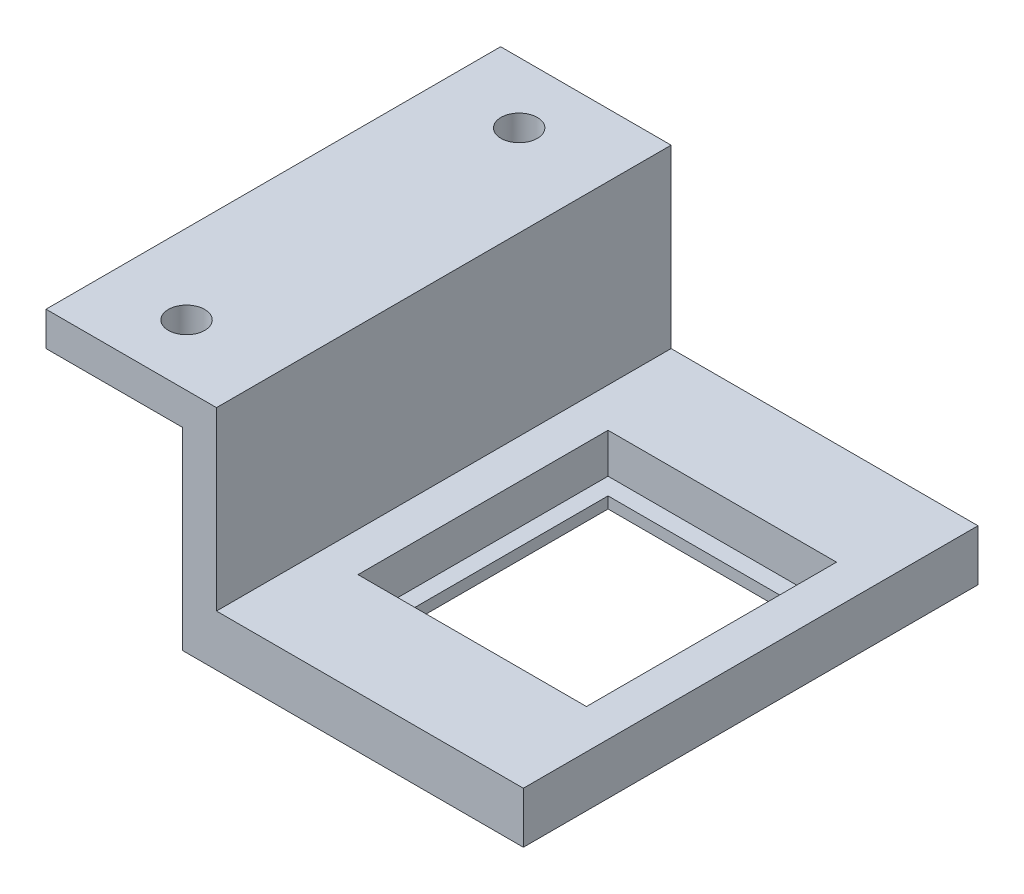
ISO-10303-21;
HEADER;
FILE_DESCRIPTION(('STEP AP214'),'2;1');
FILE_NAME('part.step','',(''),(''),'','','');
FILE_SCHEMA(('AUTOMOTIVE_DESIGN { 1 0 10303 214 1 1 1 1 }'));
ENDSEC;
DATA;
#1=APPLICATION_CONTEXT('core data for automotive mechanical design processes');
#2=APPLICATION_PROTOCOL_DEFINITION('international standard','automotive_design',2000,#1);
#3=PRODUCT_CONTEXT('',#1,'mechanical');
#4=PRODUCT('Part','Part','',(#3));
#5=PRODUCT_RELATED_PRODUCT_CATEGORY('part','',(#4));
#6=PRODUCT_DEFINITION_FORMATION('','',#4);
#7=PRODUCT_DEFINITION_CONTEXT('part definition',#1,'design');
#8=PRODUCT_DEFINITION('design','',#6,#7);
#9=PRODUCT_DEFINITION_SHAPE('','',#8);
#10=(LENGTH_UNIT() NAMED_UNIT(*) SI_UNIT(.MILLI.,.METRE.));
#11=(NAMED_UNIT(*) PLANE_ANGLE_UNIT() SI_UNIT($,.RADIAN.));
#12=(NAMED_UNIT(*) SI_UNIT($,.STERADIAN.) SOLID_ANGLE_UNIT());
#13=UNCERTAINTY_MEASURE_WITH_UNIT(LENGTH_MEASURE(1.E-05),#10,'distance_accuracy_value','');
#14=(GEOMETRIC_REPRESENTATION_CONTEXT(3) GLOBAL_UNCERTAINTY_ASSIGNED_CONTEXT((#13)) GLOBAL_UNIT_ASSIGNED_CONTEXT((#10,
#11,#12)) REPRESENTATION_CONTEXT('',''));
#15=CARTESIAN_POINT('',(0.,0.,0.));
#16=DIRECTION('',(0.,0.,1.));
#17=DIRECTION('',(1.,0.,0.));
#18=AXIS2_PLACEMENT_3D('',#15,#16,#17);
#19=CARTESIAN_POINT('',(30.,0.,-40.));
#20=DIRECTION('',(0.,-1.,0.));
#21=DIRECTION('',(0.,0.,-1.));
#22=AXIS2_PLACEMENT_3D('',#19,#20,#21);
#23=PLANE('',#22);
#24=DIRECTION('',(0.,0.,1.));
#25=VECTOR('',#24,1.);
#26=CARTESIAN_POINT('',(7.95,0.,-29.5));
#27=LINE('',#26,#25);
#28=CARTESIAN_POINT('',(7.95,0.,-29.5));
#29=VERTEX_POINT('',#28);
#30=CARTESIAN_POINT('',(7.95,0.,-10.5));
#31=VERTEX_POINT('',#30);
#32=EDGE_CURVE('E160',#29,#31,#27,.T.);
#33=ORIENTED_EDGE('',*,*,#32,.T.);
#34=DIRECTION('',(1.,0.,0.));
#35=VECTOR('',#34,1.);
#36=CARTESIAN_POINT('',(7.95,0.,-10.5));
#37=LINE('',#36,#35);
#38=CARTESIAN_POINT('',(25.05,0.,-10.5));
#39=VERTEX_POINT('',#38);
#40=EDGE_CURVE('E172',#31,#39,#37,.T.);
#41=ORIENTED_EDGE('',*,*,#40,.T.);
#42=DIRECTION('',(0.,0.,-1.));
#43=VECTOR('',#42,1.);
#44=CARTESIAN_POINT('',(25.05,0.,-29.5));
#45=LINE('',#44,#43);
#46=CARTESIAN_POINT('',(25.05,0.,-29.5));
#47=VERTEX_POINT('',#46);
#48=EDGE_CURVE('E65',#39,#47,#45,.T.);
#49=ORIENTED_EDGE('',*,*,#48,.T.);
#50=DIRECTION('',(-1.,0.,0.));
#51=VECTOR('',#50,1.);
#52=CARTESIAN_POINT('',(7.95,0.,-29.5));
#53=LINE('',#52,#51);
#54=EDGE_CURVE('E169',#47,#29,#53,.T.);
#55=ORIENTED_EDGE('',*,*,#54,.T.);
#56=EDGE_LOOP('',(#33,#41,#49,#55));
#57=FACE_BOUND('',#56,.T.);
#58=DIRECTION('',(1.,0.,0.));
#59=VECTOR('',#58,1.);
#60=CARTESIAN_POINT('',(30.,0.,0.));
#61=LINE('',#60,#59);
#62=CARTESIAN_POINT('',(0.,0.,0.));
#63=VERTEX_POINT('',#62);
#64=CARTESIAN_POINT('',(30.,0.,0.));
#65=VERTEX_POINT('',#64);
#66=EDGE_CURVE('E243',#63,#65,#61,.T.);
#67=ORIENTED_EDGE('',*,*,#66,.F.);
#68=DIRECTION('',(0.,0.,1.));
#69=VECTOR('',#68,1.);
#70=CARTESIAN_POINT('',(0.,0.,-40.));
#71=LINE('',#70,#69);
#72=CARTESIAN_POINT('',(0.,0.,-40.));
#73=VERTEX_POINT('',#72);
#74=EDGE_CURVE('E11',#73,#63,#71,.T.);
#75=ORIENTED_EDGE('',*,*,#74,.F.);
#76=DIRECTION('',(1.,0.,0.));
#77=VECTOR('',#76,1.);
#78=CARTESIAN_POINT('',(30.,0.,-40.));
#79=LINE('',#78,#77);
#80=CARTESIAN_POINT('',(30.,0.,-40.));
#81=VERTEX_POINT('',#80);
#82=EDGE_CURVE('E253',#73,#81,#79,.T.);
#83=ORIENTED_EDGE('',*,*,#82,.T.);
#84=DIRECTION('',(0.,0.,1.));
#85=VECTOR('',#84,1.);
#86=CARTESIAN_POINT('',(30.,0.,-40.));
#87=LINE('',#86,#85);
#88=EDGE_CURVE('E46',#81,#65,#87,.T.);
#89=ORIENTED_EDGE('',*,*,#88,.T.);
#90=EDGE_LOOP('',(#67,#75,#83,#89));
#91=FACE_BOUND('',#90,.T.);
#92=ADVANCED_FACE('F43',(#57,#91),#23,.T.);
#93=CARTESIAN_POINT('',(0.,0.,-40.));
#94=DIRECTION('',(-1.,0.,0.));
#95=DIRECTION('',(0.,0.,1.));
#96=AXIS2_PLACEMENT_3D('',#93,#94,#95);
#97=PLANE('',#96);
#98=DIRECTION('',(0.,-1.,0.));
#99=VECTOR('',#98,1.);
#100=CARTESIAN_POINT('',(0.,0.,0.));
#101=LINE('',#100,#99);
#102=CARTESIAN_POINT('',(0.,17.,0.));
#103=VERTEX_POINT('',#102);
#104=EDGE_CURVE('E258',#103,#63,#101,.T.);
#105=ORIENTED_EDGE('',*,*,#104,.F.);
#106=DIRECTION('',(0.,0.,1.));
#107=VECTOR('',#106,1.);
#108=CARTESIAN_POINT('',(0.,17.,-40.));
#109=LINE('',#108,#107);
#110=CARTESIAN_POINT('',(0.,17.,-40.));
#111=VERTEX_POINT('',#110);
#112=EDGE_CURVE('E52',#111,#103,#109,.T.);
#113=ORIENTED_EDGE('',*,*,#112,.F.);
#114=DIRECTION('',(0.,-1.,0.));
#115=VECTOR('',#114,1.);
#116=CARTESIAN_POINT('',(0.,0.,-40.));
#117=LINE('',#116,#115);
#118=EDGE_CURVE('E282',#111,#73,#117,.T.);
#119=ORIENTED_EDGE('',*,*,#118,.T.);
#120=ORIENTED_EDGE('',*,*,#74,.T.);
#121=EDGE_LOOP('',(#105,#113,#119,#120));
#122=FACE_BOUND('',#121,.T.);
#123=ADVANCED_FACE('F344',(#122),#97,.T.);
#124=CARTESIAN_POINT('',(0.,17.,-40.));
#125=DIRECTION('',(0.,-1.,0.));
#126=DIRECTION('',(0.,0.,-1.));
#127=AXIS2_PLACEMENT_3D('',#124,#125,#126);
#128=PLANE('',#127);
#129=CARTESIAN_POINT('',(-5.,17.,-34.63));
#130=DIRECTION('',(0.,-1.,0.));
#131=DIRECTION('',(0.,0.,-1.));
#132=AXIS2_PLACEMENT_3D('',#129,#130,#131);
#133=CIRCLE('',#132,1.6);
#134=CARTESIAN_POINT('',(-5.,17.,-36.23));
#135=VERTEX_POINT('',#134);
#136=EDGE_CURVE('E186',#135,#135,#133,.T.);
#137=ORIENTED_EDGE('',*,*,#136,.F.);
#138=EDGE_LOOP('',(#137));
#139=FACE_BOUND('',#138,.T.);
#140=CARTESIAN_POINT('',(-5.,17.,-5.366));
#141=DIRECTION('',(0.,-1.,0.));
#142=DIRECTION('',(0.,0.,-1.));
#143=AXIS2_PLACEMENT_3D('',#140,#141,#142);
#144=CIRCLE('',#143,1.6);
#145=CARTESIAN_POINT('',(-5.,17.,-6.966));
#146=VERTEX_POINT('',#145);
#147=EDGE_CURVE('E607',#146,#146,#144,.T.);
#148=ORIENTED_EDGE('',*,*,#147,.F.);
#149=EDGE_LOOP('',(#148));
#150=FACE_BOUND('',#149,.T.);
#151=DIRECTION('',(1.,0.,0.));
#152=VECTOR('',#151,1.);
#153=CARTESIAN_POINT('',(0.,17.,0.));
#154=LINE('',#153,#152);
#155=CARTESIAN_POINT('',(-12.,17.,0.));
#156=VERTEX_POINT('',#155);
#157=EDGE_CURVE('E309',#156,#103,#154,.T.);
#158=ORIENTED_EDGE('',*,*,#157,.F.);
#159=DIRECTION('',(0.,0.,1.));
#160=VECTOR('',#159,1.);
#161=CARTESIAN_POINT('',(-12.,17.,-40.));
#162=LINE('',#161,#160);
#163=CARTESIAN_POINT('',(-12.,17.,-40.));
#164=VERTEX_POINT('',#163);
#165=EDGE_CURVE('E318',#164,#156,#162,.T.);
#166=ORIENTED_EDGE('',*,*,#165,.F.);
#167=DIRECTION('',(1.,0.,0.));
#168=VECTOR('',#167,1.);
#169=CARTESIAN_POINT('',(0.,17.,-40.));
#170=LINE('',#169,#168);
#171=EDGE_CURVE('E278',#164,#111,#170,.T.);
#172=ORIENTED_EDGE('',*,*,#171,.T.);
#173=ORIENTED_EDGE('',*,*,#112,.T.);
#174=EDGE_LOOP('',(#158,#166,#172,#173));
#175=FACE_BOUND('',#174,.T.);
#176=ADVANCED_FACE('F365',(#139,#150,#175),#128,.T.);
#177=CARTESIAN_POINT('',(-12.,17.,-40.));
#178=DIRECTION('',(-1.,0.,0.));
#179=DIRECTION('',(0.,0.,1.));
#180=AXIS2_PLACEMENT_3D('',#177,#178,#179);
#181=PLANE('',#180);
#182=DIRECTION('',(0.,-1.,0.));
#183=VECTOR('',#182,1.);
#184=CARTESIAN_POINT('',(-12.,17.,0.));
#185=LINE('',#184,#183);
#186=CARTESIAN_POINT('',(-12.,20.,0.));
#187=VERTEX_POINT('',#186);
#188=EDGE_CURVE('E305',#187,#156,#185,.T.);
#189=ORIENTED_EDGE('',*,*,#188,.F.);
#190=DIRECTION('',(0.,0.,1.));
#191=VECTOR('',#190,1.);
#192=CARTESIAN_POINT('',(-12.,20.,-40.));
#193=LINE('',#192,#191);
#194=CARTESIAN_POINT('',(-12.,20.,-40.));
#195=VERTEX_POINT('',#194);
#196=EDGE_CURVE('E321',#195,#187,#193,.T.);
#197=ORIENTED_EDGE('',*,*,#196,.F.);
#198=DIRECTION('',(0.,-1.,0.));
#199=VECTOR('',#198,1.);
#200=CARTESIAN_POINT('',(-12.,17.,-40.));
#201=LINE('',#200,#199);
#202=EDGE_CURVE('E274',#195,#164,#201,.T.);
#203=ORIENTED_EDGE('',*,*,#202,.T.);
#204=ORIENTED_EDGE('',*,*,#165,.T.);
#205=EDGE_LOOP('',(#189,#197,#203,#204));
#206=FACE_BOUND('',#205,.T.);
#207=ADVANCED_FACE('F363',(#206),#181,.T.);
#208=CARTESIAN_POINT('',(-12.,20.,-40.));
#209=DIRECTION('',(0.,1.,0.));
#210=DIRECTION('',(0.,0.,1.));
#211=AXIS2_PLACEMENT_3D('',#208,#209,#210);
#212=PLANE('',#211);
#213=CARTESIAN_POINT('',(-5.,20.,-34.63));
#214=DIRECTION('',(0.,1.,0.));
#215=DIRECTION('',(0.,0.,1.));
#216=AXIS2_PLACEMENT_3D('',#213,#214,#215);
#217=CIRCLE('',#216,1.6);
#218=CARTESIAN_POINT('',(-5.,20.,-33.03));
#219=VERTEX_POINT('',#218);
#220=EDGE_CURVE('E599',#219,#219,#217,.T.);
#221=ORIENTED_EDGE('',*,*,#220,.F.);
#222=EDGE_LOOP('',(#221));
#223=FACE_BOUND('',#222,.T.);
#224=CARTESIAN_POINT('',(-5.,20.,-5.366));
#225=DIRECTION('',(0.,1.,0.));
#226=DIRECTION('',(0.,0.,1.));
#227=AXIS2_PLACEMENT_3D('',#224,#225,#226);
#228=CIRCLE('',#227,1.6);
#229=CARTESIAN_POINT('',(-5.,20.,-3.766));
#230=VERTEX_POINT('',#229);
#231=EDGE_CURVE('E602',#230,#230,#228,.T.);
#232=ORIENTED_EDGE('',*,*,#231,.F.);
#233=EDGE_LOOP('',(#232));
#234=FACE_BOUND('',#233,.T.);
#235=DIRECTION('',(-1.,0.,0.));
#236=VECTOR('',#235,1.);
#237=CARTESIAN_POINT('',(-12.,20.,0.));
#238=LINE('',#237,#236);
#239=CARTESIAN_POINT('',(3.,20.,0.));
#240=VERTEX_POINT('',#239);
#241=EDGE_CURVE('E301',#240,#187,#238,.T.);
#242=ORIENTED_EDGE('',*,*,#241,.F.);
#243=DIRECTION('',(0.,0.,1.));
#244=VECTOR('',#243,1.);
#245=CARTESIAN_POINT('',(3.,20.,-40.));
#246=LINE('',#245,#244);
#247=CARTESIAN_POINT('',(3.,20.,-40.));
#248=VERTEX_POINT('',#247);
#249=EDGE_CURVE('E324',#248,#240,#246,.T.);
#250=ORIENTED_EDGE('',*,*,#249,.F.);
#251=DIRECTION('',(-1.,0.,0.));
#252=VECTOR('',#251,1.);
#253=CARTESIAN_POINT('',(-12.,20.,-40.));
#254=LINE('',#253,#252);
#255=EDGE_CURVE('E270',#248,#195,#254,.T.);
#256=ORIENTED_EDGE('',*,*,#255,.T.);
#257=ORIENTED_EDGE('',*,*,#196,.T.);
#258=EDGE_LOOP('',(#242,#250,#256,#257));
#259=FACE_BOUND('',#258,.T.);
#260=ADVANCED_FACE('F359',(#223,#234,#259),#212,.T.);
#261=CARTESIAN_POINT('',(3.,20.,-40.));
#262=DIRECTION('',(1.,0.,0.));
#263=DIRECTION('',(0.,1.,0.));
#264=AXIS2_PLACEMENT_3D('',#261,#262,#263);
#265=PLANE('',#264);
#266=DIRECTION('',(0.,1.,0.));
#267=VECTOR('',#266,1.);
#268=CARTESIAN_POINT('',(3.,20.,0.));
#269=LINE('',#268,#267);
#270=CARTESIAN_POINT('',(3.,4.5,0.));
#271=VERTEX_POINT('',#270);
#272=EDGE_CURVE('E297',#271,#240,#269,.T.);
#273=ORIENTED_EDGE('',*,*,#272,.F.);
#274=DIRECTION('',(0.,0.,1.));
#275=VECTOR('',#274,1.);
#276=CARTESIAN_POINT('',(3.,4.5,-40.));
#277=LINE('',#276,#275);
#278=CARTESIAN_POINT('',(3.,4.5,-40.));
#279=VERTEX_POINT('',#278);
#280=EDGE_CURVE('E327',#279,#271,#277,.T.);
#281=ORIENTED_EDGE('',*,*,#280,.F.);
#282=DIRECTION('',(0.,1.,0.));
#283=VECTOR('',#282,1.);
#284=CARTESIAN_POINT('',(3.,20.,-40.));
#285=LINE('',#284,#283);
#286=EDGE_CURVE('E266',#279,#248,#285,.T.);
#287=ORIENTED_EDGE('',*,*,#286,.T.);
#288=ORIENTED_EDGE('',*,*,#249,.T.);
#289=EDGE_LOOP('',(#273,#281,#287,#288));
#290=FACE_BOUND('',#289,.T.);
#291=ADVANCED_FACE('F357',(#290),#265,.T.);
#292=CARTESIAN_POINT('',(3.,4.5,-40.));
#293=DIRECTION('',(0.,1.,0.));
#294=DIRECTION('',(0.,0.,1.));
#295=AXIS2_PLACEMENT_3D('',#292,#293,#294);
#296=PLANE('',#295);
#297=DIRECTION('',(0.,0.,1.));
#298=VECTOR('',#297,1.);
#299=CARTESIAN_POINT('',(6.45,4.5,-31.));
#300=LINE('',#299,#298);
#301=CARTESIAN_POINT('',(6.45,4.5,-31.));
#302=VERTEX_POINT('',#301);
#303=CARTESIAN_POINT('',(6.45,4.5,-9.));
#304=VERTEX_POINT('',#303);
#305=EDGE_CURVE('E203',#302,#304,#300,.T.);
#306=ORIENTED_EDGE('',*,*,#305,.F.);
#307=DIRECTION('',(-1.,0.,0.));
#308=VECTOR('',#307,1.);
#309=CARTESIAN_POINT('',(6.45,4.5,-31.));
#310=LINE('',#309,#308);
#311=CARTESIAN_POINT('',(26.55,4.5,-31.));
#312=VERTEX_POINT('',#311);
#313=EDGE_CURVE('E214',#312,#302,#310,.T.);
#314=ORIENTED_EDGE('',*,*,#313,.F.);
#315=DIRECTION('',(0.,0.,-1.));
#316=VECTOR('',#315,1.);
#317=CARTESIAN_POINT('',(26.55,4.5,-31.));
#318=LINE('',#317,#316);
#319=CARTESIAN_POINT('',(26.55,4.5,-9.));
#320=VERTEX_POINT('',#319);
#321=EDGE_CURVE('E233',#320,#312,#318,.T.);
#322=ORIENTED_EDGE('',*,*,#321,.F.);
#323=DIRECTION('',(1.,0.,0.));
#324=VECTOR('',#323,1.);
#325=CARTESIAN_POINT('',(6.45,4.5,-8.99999999999999));
#326=LINE('',#325,#324);
#327=EDGE_CURVE('E229',#304,#320,#326,.T.);
#328=ORIENTED_EDGE('',*,*,#327,.F.);
#329=EDGE_LOOP('',(#306,#314,#322,#328));
#330=FACE_BOUND('',#329,.T.);
#331=DIRECTION('',(-1.,0.,0.));
#332=VECTOR('',#331,1.);
#333=CARTESIAN_POINT('',(3.,4.5,0.));
#334=LINE('',#333,#332);
#335=CARTESIAN_POINT('',(30.,4.5,0.));
#336=VERTEX_POINT('',#335);
#337=EDGE_CURVE('E293',#336,#271,#334,.T.);
#338=ORIENTED_EDGE('',*,*,#337,.F.);
#339=DIRECTION('',(0.,0.,1.));
#340=VECTOR('',#339,1.);
#341=CARTESIAN_POINT('',(30.,4.5,-40.));
#342=LINE('',#341,#340);
#343=CARTESIAN_POINT('',(30.,4.5,-40.));
#344=VERTEX_POINT('',#343);
#345=EDGE_CURVE('E329',#344,#336,#342,.T.);
#346=ORIENTED_EDGE('',*,*,#345,.F.);
#347=DIRECTION('',(-1.,0.,0.));
#348=VECTOR('',#347,1.);
#349=CARTESIAN_POINT('',(3.,4.5,-40.));
#350=LINE('',#349,#348);
#351=EDGE_CURVE('E262',#344,#279,#350,.T.);
#352=ORIENTED_EDGE('',*,*,#351,.T.);
#353=ORIENTED_EDGE('',*,*,#280,.T.);
#354=EDGE_LOOP('',(#338,#346,#352,#353));
#355=FACE_BOUND('',#354,.T.);
#356=ADVANCED_FACE('F353',(#330,#355),#296,.T.);
#357=CARTESIAN_POINT('',(30.,4.5,-40.));
#358=DIRECTION('',(1.,0.,0.));
#359=DIRECTION('',(0.,0.,-1.));
#360=AXIS2_PLACEMENT_3D('',#357,#358,#359);
#361=PLANE('',#360);
#362=DIRECTION('',(0.,1.,0.));
#363=VECTOR('',#362,1.);
#364=CARTESIAN_POINT('',(30.,4.5,0.));
#365=LINE('',#364,#363);
#366=EDGE_CURVE('E289',#65,#336,#365,.T.);
#367=ORIENTED_EDGE('',*,*,#366,.F.);
#368=ORIENTED_EDGE('',*,*,#88,.F.);
#369=DIRECTION('',(0.,1.,0.));
#370=VECTOR('',#369,1.);
#371=CARTESIAN_POINT('',(30.,4.5,-40.));
#372=LINE('',#371,#370);
#373=EDGE_CURVE('E257',#81,#344,#372,.T.);
#374=ORIENTED_EDGE('',*,*,#373,.T.);
#375=ORIENTED_EDGE('',*,*,#345,.T.);
#376=EDGE_LOOP('',(#367,#368,#374,#375));
#377=FACE_BOUND('',#376,.T.);
#378=ADVANCED_FACE('F338',(#377),#361,.T.);
#379=CARTESIAN_POINT('',(0.,0.,-40.));
#380=DIRECTION('',(0.,0.,-1.));
#381=DIRECTION('',(-1.,0.,0.));
#382=AXIS2_PLACEMENT_3D('',#379,#380,#381);
#383=PLANE('',#382);
#384=ORIENTED_EDGE('',*,*,#82,.F.);
#385=ORIENTED_EDGE('',*,*,#118,.F.);
#386=ORIENTED_EDGE('',*,*,#171,.F.);
#387=ORIENTED_EDGE('',*,*,#202,.F.);
#388=ORIENTED_EDGE('',*,*,#255,.F.);
#389=ORIENTED_EDGE('',*,*,#286,.F.);
#390=ORIENTED_EDGE('',*,*,#351,.F.);
#391=ORIENTED_EDGE('',*,*,#373,.F.);
#392=EDGE_LOOP('',(#384,#385,#386,#387,#388,#389,#390,#391));
#393=FACE_BOUND('',#392,.T.);
#394=ADVANCED_FACE('F347',(#393),#383,.T.);
#395=CARTESIAN_POINT('',(0.,0.,0.));
#396=DIRECTION('',(0.,0.,-1.));
#397=DIRECTION('',(-1.,0.,0.));
#398=AXIS2_PLACEMENT_3D('',#395,#396,#397);
#399=PLANE('',#398);
#400=ORIENTED_EDGE('',*,*,#66,.T.);
#401=ORIENTED_EDGE('',*,*,#366,.T.);
#402=ORIENTED_EDGE('',*,*,#337,.T.);
#403=ORIENTED_EDGE('',*,*,#272,.T.);
#404=ORIENTED_EDGE('',*,*,#241,.T.);
#405=ORIENTED_EDGE('',*,*,#188,.T.);
#406=ORIENTED_EDGE('',*,*,#157,.T.);
#407=ORIENTED_EDGE('',*,*,#104,.T.);
#408=EDGE_LOOP('',(#400,#401,#402,#403,#404,#405,#406,#407));
#409=FACE_BOUND('',#408,.T.);
#410=ADVANCED_FACE('F340',(#409),#399,.F.);
#411=CARTESIAN_POINT('',(6.45,1.,-31.));
#412=DIRECTION('',(-1.,0.,0.));
#413=DIRECTION('',(0.,0.,1.));
#414=AXIS2_PLACEMENT_3D('',#411,#412,#413);
#415=PLANE('',#414);
#416=ORIENTED_EDGE('',*,*,#305,.T.);
#417=DIRECTION('',(0.,1.,0.));
#418=VECTOR('',#417,1.);
#419=CARTESIAN_POINT('',(6.45,1.,-8.99999999999999));
#420=LINE('',#419,#418);
#421=CARTESIAN_POINT('',(6.45,1.,-8.99999999999999));
#422=VERTEX_POINT('',#421);
#423=EDGE_CURVE('E226',#422,#304,#420,.T.);
#424=ORIENTED_EDGE('',*,*,#423,.F.);
#425=DIRECTION('',(0.,0.,1.));
#426=VECTOR('',#425,1.);
#427=CARTESIAN_POINT('',(6.45,1.,-31.));
#428=LINE('',#427,#426);
#429=CARTESIAN_POINT('',(6.45,1.,-31.));
#430=VERTEX_POINT('',#429);
#431=EDGE_CURVE('E209',#430,#422,#428,.T.);
#432=ORIENTED_EDGE('',*,*,#431,.F.);
#433=DIRECTION('',(0.,1.,0.));
#434=VECTOR('',#433,1.);
#435=CARTESIAN_POINT('',(6.45,1.,-31.));
#436=LINE('',#435,#434);
#437=EDGE_CURVE('E240',#430,#302,#436,.T.);
#438=ORIENTED_EDGE('',*,*,#437,.T.);
#439=EDGE_LOOP('',(#416,#424,#432,#438));
#440=FACE_BOUND('',#439,.T.);
#441=ADVANCED_FACE('F434',(#440),#415,.F.);
#442=CARTESIAN_POINT('',(6.45,1.,-31.));
#443=DIRECTION('',(0.,0.,-1.));
#444=DIRECTION('',(-1.,0.,0.));
#445=AXIS2_PLACEMENT_3D('',#442,#443,#444);
#446=PLANE('',#445);
#447=ORIENTED_EDGE('',*,*,#313,.T.);
#448=ORIENTED_EDGE('',*,*,#437,.F.);
#449=DIRECTION('',(-1.,0.,0.));
#450=VECTOR('',#449,1.);
#451=CARTESIAN_POINT('',(6.45,1.,-31.));
#452=LINE('',#451,#450);
#453=CARTESIAN_POINT('',(26.55,1.,-31.));
#454=VERTEX_POINT('',#453);
#455=EDGE_CURVE('E222',#454,#430,#452,.T.);
#456=ORIENTED_EDGE('',*,*,#455,.F.);
#457=DIRECTION('',(0.,1.,0.));
#458=VECTOR('',#457,1.);
#459=CARTESIAN_POINT('',(26.55,1.,-31.));
#460=LINE('',#459,#458);
#461=EDGE_CURVE('E244',#454,#312,#460,.T.);
#462=ORIENTED_EDGE('',*,*,#461,.T.);
#463=EDGE_LOOP('',(#447,#448,#456,#462));
#464=FACE_BOUND('',#463,.T.);
#465=ADVANCED_FACE('F452',(#464),#446,.F.);
#466=CARTESIAN_POINT('',(26.55,1.,-31.));
#467=DIRECTION('',(1.,0.,0.));
#468=DIRECTION('',(0.,0.,-1.));
#469=AXIS2_PLACEMENT_3D('',#466,#467,#468);
#470=PLANE('',#469);
#471=ORIENTED_EDGE('',*,*,#321,.T.);
#472=ORIENTED_EDGE('',*,*,#461,.F.);
#473=DIRECTION('',(0.,0.,-1.));
#474=VECTOR('',#473,1.);
#475=CARTESIAN_POINT('',(26.55,1.,-31.));
#476=LINE('',#475,#474);
#477=CARTESIAN_POINT('',(26.55,1.,-9.));
#478=VERTEX_POINT('',#477);
#479=EDGE_CURVE('E218',#478,#454,#476,.T.);
#480=ORIENTED_EDGE('',*,*,#479,.F.);
#481=DIRECTION('',(0.,1.,0.));
#482=VECTOR('',#481,1.);
#483=CARTESIAN_POINT('',(26.55,1.,-9.));
#484=LINE('',#483,#482);
#485=EDGE_CURVE('E247',#478,#320,#484,.T.);
#486=ORIENTED_EDGE('',*,*,#485,.T.);
#487=EDGE_LOOP('',(#471,#472,#480,#486));
#488=FACE_BOUND('',#487,.T.);
#489=ADVANCED_FACE('F463',(#488),#470,.F.);
#490=CARTESIAN_POINT('',(6.45,1.,-8.99999999999999));
#491=DIRECTION('',(0.,0.,1.));
#492=DIRECTION('',(1.,0.,0.));
#493=AXIS2_PLACEMENT_3D('',#490,#491,#492);
#494=PLANE('',#493);
#495=ORIENTED_EDGE('',*,*,#327,.T.);
#496=ORIENTED_EDGE('',*,*,#485,.F.);
#497=DIRECTION('',(1.,0.,0.));
#498=VECTOR('',#497,1.);
#499=CARTESIAN_POINT('',(6.45,1.,-8.99999999999999));
#500=LINE('',#499,#498);
#501=EDGE_CURVE('E213',#422,#478,#500,.T.);
#502=ORIENTED_EDGE('',*,*,#501,.F.);
#503=ORIENTED_EDGE('',*,*,#423,.T.);
#504=EDGE_LOOP('',(#495,#496,#502,#503));
#505=FACE_BOUND('',#504,.T.);
#506=ADVANCED_FACE('F473',(#505),#494,.F.);
#507=CARTESIAN_POINT('',(0.,1.,0.));
#508=DIRECTION('',(0.,1.,0.));
#509=DIRECTION('',(0.,0.,1.));
#510=AXIS2_PLACEMENT_3D('',#507,#508,#509);
#511=PLANE('',#510);
#512=DIRECTION('',(0.,0.,1.));
#513=VECTOR('',#512,1.);
#514=CARTESIAN_POINT('',(7.95,1.,-29.5));
#515=LINE('',#514,#513);
#516=CARTESIAN_POINT('',(7.95,1.,-29.5));
#517=VERTEX_POINT('',#516);
#518=CARTESIAN_POINT('',(7.95,1.,-10.5));
#519=VERTEX_POINT('',#518);
#520=EDGE_CURVE('E163',#517,#519,#515,.T.);
#521=ORIENTED_EDGE('',*,*,#520,.F.);
#522=DIRECTION('',(-1.,0.,0.));
#523=VECTOR('',#522,1.);
#524=CARTESIAN_POINT('',(7.95,1.,-29.5));
#525=LINE('',#524,#523);
#526=CARTESIAN_POINT('',(25.05,1.,-29.5));
#527=VERTEX_POINT('',#526);
#528=EDGE_CURVE('E180',#527,#517,#525,.T.);
#529=ORIENTED_EDGE('',*,*,#528,.F.);
#530=DIRECTION('',(0.,0.,-1.));
#531=VECTOR('',#530,1.);
#532=CARTESIAN_POINT('',(25.05,1.,-29.5));
#533=LINE('',#532,#531);
#534=CARTESIAN_POINT('',(25.05,1.,-10.5));
#535=VERTEX_POINT('',#534);
#536=EDGE_CURVE('E60',#535,#527,#533,.T.);
#537=ORIENTED_EDGE('',*,*,#536,.F.);
#538=DIRECTION('',(1.,0.,0.));
#539=VECTOR('',#538,1.);
#540=CARTESIAN_POINT('',(7.95,1.,-10.5));
#541=LINE('',#540,#539);
#542=EDGE_CURVE('E195',#519,#535,#541,.T.);
#543=ORIENTED_EDGE('',*,*,#542,.F.);
#544=EDGE_LOOP('',(#521,#529,#537,#543));
#545=FACE_BOUND('',#544,.T.);
#546=ORIENTED_EDGE('',*,*,#431,.T.);
#547=ORIENTED_EDGE('',*,*,#501,.T.);
#548=ORIENTED_EDGE('',*,*,#479,.T.);
#549=ORIENTED_EDGE('',*,*,#455,.T.);
#550=EDGE_LOOP('',(#546,#547,#548,#549));
#551=FACE_BOUND('',#550,.T.);
#552=ADVANCED_FACE('F483',(#545,#551),#511,.T.);
#553=CARTESIAN_POINT('',(7.95,0.,-29.5));
#554=DIRECTION('',(-1.,0.,0.));
#555=DIRECTION('',(0.,0.,1.));
#556=AXIS2_PLACEMENT_3D('',#553,#554,#555);
#557=PLANE('',#556);
#558=ORIENTED_EDGE('',*,*,#520,.T.);
#559=DIRECTION('',(0.,1.,0.));
#560=VECTOR('',#559,1.);
#561=CARTESIAN_POINT('',(7.95,0.,-10.5));
#562=LINE('',#561,#560);
#563=EDGE_CURVE('E156',#31,#519,#562,.T.);
#564=ORIENTED_EDGE('',*,*,#563,.F.);
#565=ORIENTED_EDGE('',*,*,#32,.F.);
#566=DIRECTION('',(0.,1.,0.));
#567=VECTOR('',#566,1.);
#568=CARTESIAN_POINT('',(7.95,0.,-29.5));
#569=LINE('',#568,#567);
#570=EDGE_CURVE('E200',#29,#517,#569,.T.);
#571=ORIENTED_EDGE('',*,*,#570,.T.);
#572=EDGE_LOOP('',(#558,#564,#565,#571));
#573=FACE_BOUND('',#572,.T.);
#574=ADVANCED_FACE('F158',(#573),#557,.F.);
#575=CARTESIAN_POINT('',(7.95,0.,-29.5));
#576=DIRECTION('',(0.,0.,-1.));
#577=DIRECTION('',(-1.,0.,0.));
#578=AXIS2_PLACEMENT_3D('',#575,#576,#577);
#579=PLANE('',#578);
#580=ORIENTED_EDGE('',*,*,#528,.T.);
#581=ORIENTED_EDGE('',*,*,#570,.F.);
#582=ORIENTED_EDGE('',*,*,#54,.F.);
#583=DIRECTION('',(0.,1.,0.));
#584=VECTOR('',#583,1.);
#585=CARTESIAN_POINT('',(25.05,0.,-29.5));
#586=LINE('',#585,#584);
#587=EDGE_CURVE('E204',#47,#527,#586,.T.);
#588=ORIENTED_EDGE('',*,*,#587,.T.);
#589=EDGE_LOOP('',(#580,#581,#582,#588));
#590=FACE_BOUND('',#589,.T.);
#591=ADVANCED_FACE('F500',(#590),#579,.F.);
#592=CARTESIAN_POINT('',(25.05,0.,-29.5));
#593=DIRECTION('',(1.,0.,0.));
#594=DIRECTION('',(0.,0.,-1.));
#595=AXIS2_PLACEMENT_3D('',#592,#593,#594);
#596=PLANE('',#595);
#597=ORIENTED_EDGE('',*,*,#536,.T.);
#598=ORIENTED_EDGE('',*,*,#587,.F.);
#599=ORIENTED_EDGE('',*,*,#48,.F.);
#600=DIRECTION('',(0.,1.,0.));
#601=VECTOR('',#600,1.);
#602=CARTESIAN_POINT('',(25.05,0.,-10.5));
#603=LINE('',#602,#601);
#604=EDGE_CURVE('E168',#39,#535,#603,.T.);
#605=ORIENTED_EDGE('',*,*,#604,.T.);
#606=EDGE_LOOP('',(#597,#598,#599,#605));
#607=FACE_BOUND('',#606,.T.);
#608=ADVANCED_FACE('F507',(#607),#596,.F.);
#609=CARTESIAN_POINT('',(7.95,0.,-10.5));
#610=DIRECTION('',(0.,0.,1.));
#611=DIRECTION('',(1.,0.,0.));
#612=AXIS2_PLACEMENT_3D('',#609,#610,#611);
#613=PLANE('',#612);
#614=ORIENTED_EDGE('',*,*,#542,.T.);
#615=ORIENTED_EDGE('',*,*,#604,.F.);
#616=ORIENTED_EDGE('',*,*,#40,.F.);
#617=ORIENTED_EDGE('',*,*,#563,.T.);
#618=EDGE_LOOP('',(#614,#615,#616,#617));
#619=FACE_BOUND('',#618,.T.);
#620=ADVANCED_FACE('F173',(#619),#613,.F.);
#621=CARTESIAN_POINT('',(-5.,0.,-5.366));
#622=DIRECTION('',(0.,1.,0.));
#623=DIRECTION('',(0.,0.,1.));
#624=AXIS2_PLACEMENT_3D('',#621,#622,#623);
#625=CYLINDRICAL_SURFACE('',#624,1.6);
#626=ORIENTED_EDGE('',*,*,#147,.T.);
#627=EDGE_LOOP('',(#626));
#628=FACE_BOUND('',#627,.T.);
#629=ORIENTED_EDGE('',*,*,#231,.T.);
#630=EDGE_LOOP('',(#629));
#631=FACE_BOUND('',#630,.T.);
#632=ADVANCED_FACE('F521',(#628,#631),#625,.F.);
#633=CARTESIAN_POINT('',(-5.,0.,-34.63));
#634=DIRECTION('',(0.,1.,0.));
#635=DIRECTION('',(0.,0.,1.));
#636=AXIS2_PLACEMENT_3D('',#633,#634,#635);
#637=CYLINDRICAL_SURFACE('',#636,1.6);
#638=ORIENTED_EDGE('',*,*,#136,.T.);
#639=EDGE_LOOP('',(#638));
#640=FACE_BOUND('',#639,.T.);
#641=ORIENTED_EDGE('',*,*,#220,.T.);
#642=EDGE_LOOP('',(#641));
#643=FACE_BOUND('',#642,.T.);
#644=ADVANCED_FACE('F528',(#640,#643),#637,.F.);
#645=CLOSED_SHELL('',(#92,#123,#176,#207,#260,#291,#356,#378,#394,#410,#441,#465,#489,#506,#552,
#574,#591,#608,#620,#632,#644));
#646=MANIFOLD_SOLID_BREP('B2',#645);
#647=ADVANCED_BREP_SHAPE_REPRESENTATION('',(#18,#646),#14);
#648=SHAPE_DEFINITION_REPRESENTATION(#9,#647);
ENDSEC;
END-ISO-10303-21;
